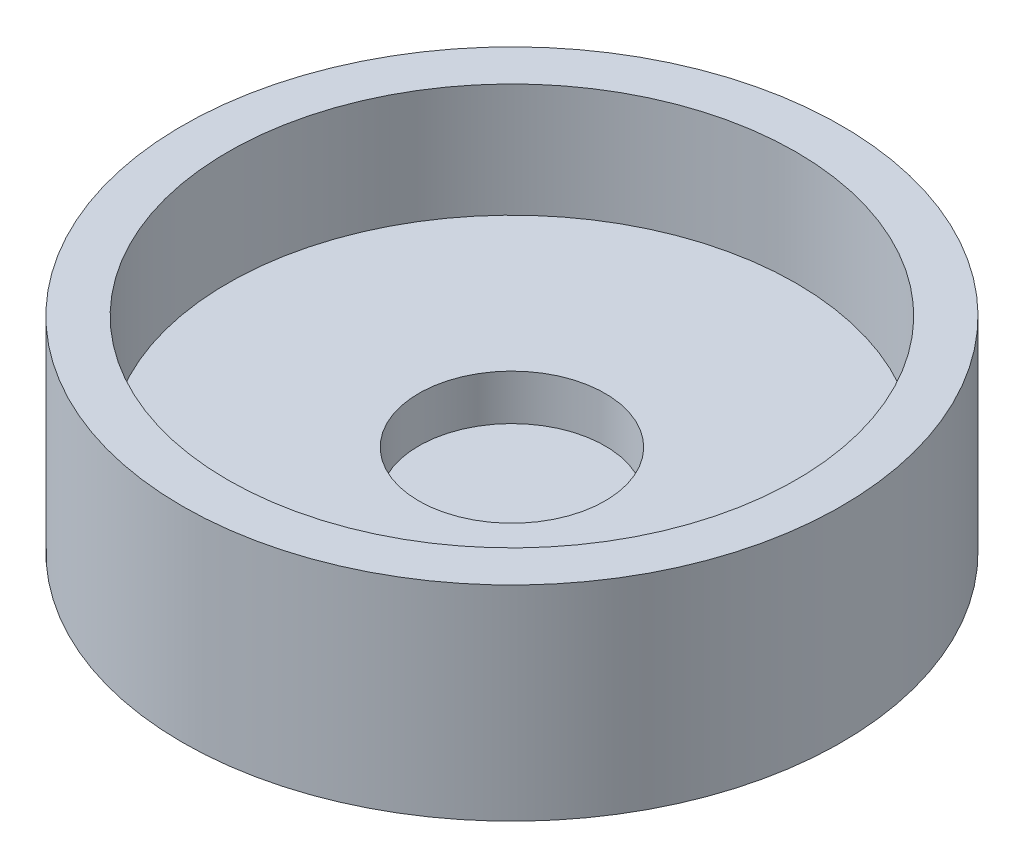
ISO-10303-21;
HEADER;
FILE_DESCRIPTION(('STEP AP214'),'2;1');
FILE_NAME('part.step','',(''),(''),'','','');
FILE_SCHEMA(('AUTOMOTIVE_DESIGN { 1 0 10303 214 1 1 1 1 }'));
ENDSEC;
DATA;
#1=APPLICATION_CONTEXT('core data for automotive mechanical design processes');
#2=APPLICATION_PROTOCOL_DEFINITION('international standard','automotive_design',2000,#1);
#3=PRODUCT_CONTEXT('',#1,'mechanical');
#4=PRODUCT('Part','Part','',(#3));
#5=PRODUCT_RELATED_PRODUCT_CATEGORY('part','',(#4));
#6=PRODUCT_DEFINITION_FORMATION('','',#4);
#7=PRODUCT_DEFINITION_CONTEXT('part definition',#1,'design');
#8=PRODUCT_DEFINITION('design','',#6,#7);
#9=PRODUCT_DEFINITION_SHAPE('','',#8);
#10=(LENGTH_UNIT() NAMED_UNIT(*) SI_UNIT(.MILLI.,.METRE.));
#11=(NAMED_UNIT(*) PLANE_ANGLE_UNIT() SI_UNIT($,.RADIAN.));
#12=(NAMED_UNIT(*) SI_UNIT($,.STERADIAN.) SOLID_ANGLE_UNIT());
#13=UNCERTAINTY_MEASURE_WITH_UNIT(LENGTH_MEASURE(1.E-05),#10,'distance_accuracy_value','');
#14=(GEOMETRIC_REPRESENTATION_CONTEXT(3) GLOBAL_UNCERTAINTY_ASSIGNED_CONTEXT((#13)) GLOBAL_UNIT_ASSIGNED_CONTEXT((#10,
#11,#12)) REPRESENTATION_CONTEXT('',''));
#15=CARTESIAN_POINT('',(0.,0.,0.));
#16=DIRECTION('',(0.,0.,1.));
#17=DIRECTION('',(1.,0.,0.));
#18=AXIS2_PLACEMENT_3D('',#15,#16,#17);
#19=CARTESIAN_POINT('',(0.,5.,0.));
#20=DIRECTION('',(0.,1.,0.));
#21=DIRECTION('',(0.,0.,1.));
#22=AXIS2_PLACEMENT_3D('',#19,#20,#21);
#23=PLANE('',#22);
#24=CARTESIAN_POINT('',(0.,5.,0.));
#25=DIRECTION('',(0.,1.,0.));
#26=DIRECTION('',(0.,0.,1.));
#27=AXIS2_PLACEMENT_3D('',#24,#25,#26);
#28=CIRCLE('',#27,14.5);
#29=CARTESIAN_POINT('',(0.,5.,14.5));
#30=VERTEX_POINT('',#29);
#31=EDGE_CURVE('E10',#30,#30,#28,.T.);
#32=ORIENTED_EDGE('',*,*,#31,.T.);
#33=EDGE_LOOP('',(#32));
#34=FACE_BOUND('',#33,.T.);
#35=CARTESIAN_POINT('',(0.,5.,0.));
#36=DIRECTION('',(0.,1.,0.));
#37=DIRECTION('',(0.,0.,1.));
#38=AXIS2_PLACEMENT_3D('',#35,#36,#37);
#39=CIRCLE('',#38,12.5);
#40=CARTESIAN_POINT('',(0.,5.,12.5));
#41=VERTEX_POINT('',#40);
#42=EDGE_CURVE('E46',#41,#41,#39,.T.);
#43=ORIENTED_EDGE('',*,*,#42,.F.);
#44=EDGE_LOOP('',(#43));
#45=FACE_BOUND('',#44,.T.);
#46=ADVANCED_FACE('F39',(#34,#45),#23,.T.);
#47=CARTESIAN_POINT('',(0.,5.,0.));
#48=DIRECTION('',(0.,-1.,0.));
#49=DIRECTION('',(0.,0.,-1.));
#50=AXIS2_PLACEMENT_3D('',#47,#48,#49);
#51=CYLINDRICAL_SURFACE('',#50,14.5);
#52=ORIENTED_EDGE('',*,*,#31,.F.);
#53=EDGE_LOOP('',(#52));
#54=FACE_BOUND('',#53,.T.);
#55=CARTESIAN_POINT('',(0.,-4.,0.));
#56=DIRECTION('',(0.,1.,0.));
#57=DIRECTION('',(0.,0.,1.));
#58=AXIS2_PLACEMENT_3D('',#55,#56,#57);
#59=CIRCLE('',#58,14.5);
#60=CARTESIAN_POINT('',(0.,-4.,14.5));
#61=VERTEX_POINT('',#60);
#62=EDGE_CURVE('E55',#61,#61,#59,.T.);
#63=ORIENTED_EDGE('',*,*,#62,.T.);
#64=EDGE_LOOP('',(#63));
#65=FACE_BOUND('',#64,.T.);
#66=ADVANCED_FACE('F41',(#54,#65),#51,.T.);
#67=CARTESIAN_POINT('',(0.,5.,0.));
#68=DIRECTION('',(0.,-1.,0.));
#69=DIRECTION('',(0.,0.,-1.));
#70=AXIS2_PLACEMENT_3D('',#67,#68,#69);
#71=CYLINDRICAL_SURFACE('',#70,12.5);
#72=ORIENTED_EDGE('',*,*,#42,.T.);
#73=EDGE_LOOP('',(#72));
#74=FACE_BOUND('',#73,.T.);
#75=CARTESIAN_POINT('',(0.,0.,0.));
#76=DIRECTION('',(0.,1.,0.));
#77=DIRECTION('',(0.,0.,1.));
#78=AXIS2_PLACEMENT_3D('',#75,#76,#77);
#79=CIRCLE('',#78,12.5);
#80=CARTESIAN_POINT('',(0.,0.,12.5));
#81=VERTEX_POINT('',#80);
#82=EDGE_CURVE('E50',#81,#81,#79,.T.);
#83=ORIENTED_EDGE('',*,*,#82,.F.);
#84=EDGE_LOOP('',(#83));
#85=FACE_BOUND('',#84,.T.);
#86=ADVANCED_FACE('F78',(#74,#85),#71,.F.);
#87=CARTESIAN_POINT('',(0.,0.,0.));
#88=DIRECTION('',(0.,1.,0.));
#89=DIRECTION('',(0.,0.,1.));
#90=AXIS2_PLACEMENT_3D('',#87,#88,#89);
#91=PLANE('',#90);
#92=CARTESIAN_POINT('',(0.,0.,0.));
#93=DIRECTION('',(0.,1.,0.));
#94=DIRECTION('',(0.,0.,1.));
#95=AXIS2_PLACEMENT_3D('',#92,#93,#94);
#96=CIRCLE('',#95,4.1);
#97=CARTESIAN_POINT('',(0.,0.,4.1));
#98=VERTEX_POINT('',#97);
#99=EDGE_CURVE('E60',#98,#98,#96,.T.);
#100=ORIENTED_EDGE('',*,*,#99,.F.);
#101=EDGE_LOOP('',(#100));
#102=FACE_BOUND('',#101,.T.);
#103=ORIENTED_EDGE('',*,*,#82,.T.);
#104=EDGE_LOOP('',(#103));
#105=FACE_BOUND('',#104,.T.);
#106=ADVANCED_FACE('F75',(#102,#105),#91,.T.);
#107=CARTESIAN_POINT('',(0.,-4.,0.));
#108=DIRECTION('',(0.,1.,0.));
#109=DIRECTION('',(0.,0.,1.));
#110=AXIS2_PLACEMENT_3D('',#107,#108,#109);
#111=PLANE('',#110);
#112=ORIENTED_EDGE('',*,*,#62,.F.);
#113=EDGE_LOOP('',(#112));
#114=FACE_BOUND('',#113,.T.);
#115=ADVANCED_FACE('F71',(#114),#111,.F.);
#116=CARTESIAN_POINT('',(0.,-2.,0.));
#117=DIRECTION('',(0.,1.,0.));
#118=DIRECTION('',(0.,0.,1.));
#119=AXIS2_PLACEMENT_3D('',#116,#117,#118);
#120=CYLINDRICAL_SURFACE('',#119,4.1);
#121=CARTESIAN_POINT('',(0.,-2.,0.));
#122=DIRECTION('',(0.,1.,0.));
#123=DIRECTION('',(0.,0.,1.));
#124=AXIS2_PLACEMENT_3D('',#121,#122,#123);
#125=CIRCLE('',#124,4.1);
#126=CARTESIAN_POINT('',(0.,-2.,4.1));
#127=VERTEX_POINT('',#126);
#128=EDGE_CURVE('E59',#127,#127,#125,.T.);
#129=ORIENTED_EDGE('',*,*,#128,.F.);
#130=EDGE_LOOP('',(#129));
#131=FACE_BOUND('',#130,.T.);
#132=ORIENTED_EDGE('',*,*,#99,.T.);
#133=EDGE_LOOP('',(#132));
#134=FACE_BOUND('',#133,.T.);
#135=ADVANCED_FACE('F68',(#131,#134),#120,.F.);
#136=CARTESIAN_POINT('',(0.,-2.,0.));
#137=DIRECTION('',(0.,1.,0.));
#138=DIRECTION('',(0.,0.,1.));
#139=AXIS2_PLACEMENT_3D('',#136,#137,#138);
#140=PLANE('',#139);
#141=ORIENTED_EDGE('',*,*,#128,.T.);
#142=EDGE_LOOP('',(#141));
#143=FACE_BOUND('',#142,.T.);
#144=ADVANCED_FACE('F66',(#143),#140,.T.);
#145=CLOSED_SHELL('',(#46,#66,#86,#106,#115,#135,#144));
#146=MANIFOLD_SOLID_BREP('B2',#145);
#147=ADVANCED_BREP_SHAPE_REPRESENTATION('',(#18,#146),#14);
#148=SHAPE_DEFINITION_REPRESENTATION(#9,#147);
ENDSEC;
END-ISO-10303-21;
